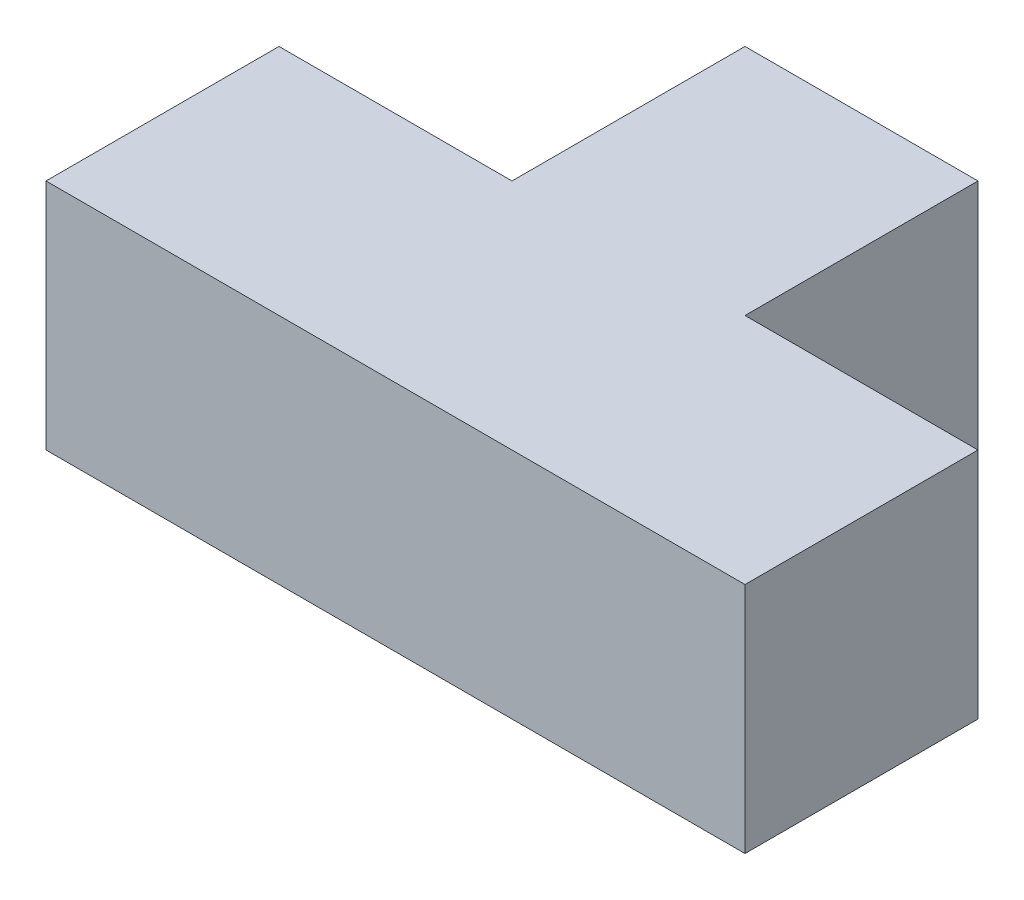
ISO-10303-21;
HEADER;
FILE_DESCRIPTION(('STEP AP214'),'2;1');
FILE_NAME('part.step','',(''),(''),'','','');
FILE_SCHEMA(('AUTOMOTIVE_DESIGN { 1 0 10303 214 1 1 1 1 }'));
ENDSEC;
DATA;
#1=APPLICATION_CONTEXT('core data for automotive mechanical design processes');
#2=APPLICATION_PROTOCOL_DEFINITION('international standard','automotive_design',2000,#1);
#3=PRODUCT_CONTEXT('',#1,'mechanical');
#4=PRODUCT('Part','Part','',(#3));
#5=PRODUCT_RELATED_PRODUCT_CATEGORY('part','',(#4));
#6=PRODUCT_DEFINITION_FORMATION('','',#4);
#7=PRODUCT_DEFINITION_CONTEXT('part definition',#1,'design');
#8=PRODUCT_DEFINITION('design','',#6,#7);
#9=PRODUCT_DEFINITION_SHAPE('','',#8);
#10=(LENGTH_UNIT() NAMED_UNIT(*) SI_UNIT(.MILLI.,.METRE.));
#11=(NAMED_UNIT(*) PLANE_ANGLE_UNIT() SI_UNIT($,.RADIAN.));
#12=(NAMED_UNIT(*) SI_UNIT($,.STERADIAN.) SOLID_ANGLE_UNIT());
#13=UNCERTAINTY_MEASURE_WITH_UNIT(LENGTH_MEASURE(1.E-05),#10,'distance_accuracy_value','');
#14=(GEOMETRIC_REPRESENTATION_CONTEXT(3) GLOBAL_UNCERTAINTY_ASSIGNED_CONTEXT((#13)) GLOBAL_UNIT_ASSIGNED_CONTEXT((#10,
#11,#12)) REPRESENTATION_CONTEXT('',''));
#15=CARTESIAN_POINT('',(0.,0.,0.));
#16=DIRECTION('',(0.,0.,1.));
#17=DIRECTION('',(1.,0.,0.));
#18=AXIS2_PLACEMENT_3D('',#15,#16,#17);
#19=CARTESIAN_POINT('',(0.,30.,0.));
#20=DIRECTION('',(0.,0.,-1.));
#21=DIRECTION('',(-1.,0.,0.));
#22=AXIS2_PLACEMENT_3D('',#19,#20,#21);
#23=PLANE('',#22);
#24=DIRECTION('',(1.,0.,0.));
#25=VECTOR('',#24,1.);
#26=CARTESIAN_POINT('',(0.,0.,0.));
#27=LINE('',#26,#25);
#28=CARTESIAN_POINT('',(-30.,0.,0.));
#29=VERTEX_POINT('',#28);
#30=CARTESIAN_POINT('',(60.,0.,0.));
#31=VERTEX_POINT('',#30);
#32=EDGE_CURVE('E129',#29,#31,#27,.T.);
#33=ORIENTED_EDGE('',*,*,#32,.T.);
#34=DIRECTION('',(0.,-1.,0.));
#35=VECTOR('',#34,1.);
#36=CARTESIAN_POINT('',(60.,30.,0.));
#37=LINE('',#36,#35);
#38=CARTESIAN_POINT('',(60.,30.,0.));
#39=VERTEX_POINT('',#38);
#40=EDGE_CURVE('E11',#39,#31,#37,.T.);
#41=ORIENTED_EDGE('',*,*,#40,.F.);
#42=DIRECTION('',(1.,0.,0.));
#43=VECTOR('',#42,1.);
#44=CARTESIAN_POINT('',(0.,30.,0.));
#45=LINE('',#44,#43);
#46=CARTESIAN_POINT('',(-30.,30.,0.));
#47=VERTEX_POINT('',#46);
#48=EDGE_CURVE('E122',#47,#39,#45,.T.);
#49=ORIENTED_EDGE('',*,*,#48,.F.);
#50=DIRECTION('',(0.,1.,0.));
#51=VECTOR('',#50,1.);
#52=CARTESIAN_POINT('',(-30.,0.,0.));
#53=LINE('',#52,#51);
#54=EDGE_CURVE('E172',#29,#47,#53,.T.);
#55=ORIENTED_EDGE('',*,*,#54,.F.);
#56=EDGE_LOOP('',(#33,#41,#49,#55));
#57=FACE_BOUND('',#56,.T.);
#58=ADVANCED_FACE('F39',(#57),#23,.F.);
#59=CARTESIAN_POINT('',(60.,30.,0.));
#60=DIRECTION('',(-1.,0.,0.));
#61=DIRECTION('',(0.,0.,1.));
#62=AXIS2_PLACEMENT_3D('',#59,#60,#61);
#63=PLANE('',#62);
#64=DIRECTION('',(0.,0.,-1.));
#65=VECTOR('',#64,1.);
#66=CARTESIAN_POINT('',(60.,0.,0.));
#67=LINE('',#66,#65);
#68=CARTESIAN_POINT('',(60.,0.,-30.));
#69=VERTEX_POINT('',#68);
#70=EDGE_CURVE('E132',#31,#69,#67,.T.);
#71=ORIENTED_EDGE('',*,*,#70,.T.);
#72=DIRECTION('',(0.,-1.,0.));
#73=VECTOR('',#72,1.);
#74=CARTESIAN_POINT('',(60.,30.,-30.));
#75=LINE('',#74,#73);
#76=CARTESIAN_POINT('',(60.,30.,-30.));
#77=VERTEX_POINT('',#76);
#78=EDGE_CURVE('E46',#77,#69,#75,.T.);
#79=ORIENTED_EDGE('',*,*,#78,.F.);
#80=DIRECTION('',(0.,0.,-1.));
#81=VECTOR('',#80,1.);
#82=CARTESIAN_POINT('',(60.,30.,0.));
#83=LINE('',#82,#81);
#84=EDGE_CURVE('E90',#39,#77,#83,.T.);
#85=ORIENTED_EDGE('',*,*,#84,.F.);
#86=ORIENTED_EDGE('',*,*,#40,.T.);
#87=EDGE_LOOP('',(#71,#79,#85,#86));
#88=FACE_BOUND('',#87,.T.);
#89=ADVANCED_FACE('F143',(#88),#63,.F.);
#90=CARTESIAN_POINT('',(0.,30.,-30.));
#91=DIRECTION('',(0.,0.,-1.));
#92=DIRECTION('',(-1.,0.,0.));
#93=AXIS2_PLACEMENT_3D('',#90,#91,#92);
#94=PLANE('',#93);
#95=DIRECTION('',(1.,0.,0.));
#96=VECTOR('',#95,1.);
#97=CARTESIAN_POINT('',(0.,0.,-30.));
#98=LINE('',#97,#96);
#99=CARTESIAN_POINT('',(30.,0.,-30.));
#100=VERTEX_POINT('',#99);
#101=EDGE_CURVE('E106',#100,#69,#98,.T.);
#102=ORIENTED_EDGE('',*,*,#101,.F.);
#103=DIRECTION('',(0.,-1.,0.));
#104=VECTOR('',#103,1.);
#105=CARTESIAN_POINT('',(30.,30.,-30.));
#106=LINE('',#105,#104);
#107=CARTESIAN_POINT('',(30.,30.,-30.));
#108=VERTEX_POINT('',#107);
#109=EDGE_CURVE('E100',#108,#100,#106,.T.);
#110=ORIENTED_EDGE('',*,*,#109,.F.);
#111=DIRECTION('',(1.,0.,0.));
#112=VECTOR('',#111,1.);
#113=CARTESIAN_POINT('',(0.,30.,-30.));
#114=LINE('',#113,#112);
#115=EDGE_CURVE('E104',#108,#77,#114,.T.);
#116=ORIENTED_EDGE('',*,*,#115,.T.);
#117=ORIENTED_EDGE('',*,*,#78,.T.);
#118=EDGE_LOOP('',(#102,#110,#116,#117));
#119=FACE_BOUND('',#118,.T.);
#120=ADVANCED_FACE('F102',(#119),#94,.T.);
#121=CARTESIAN_POINT('',(30.,30.,0.));
#122=DIRECTION('',(-1.,0.,0.));
#123=DIRECTION('',(0.,0.,1.));
#124=AXIS2_PLACEMENT_3D('',#121,#122,#123);
#125=PLANE('',#124);
#126=DIRECTION('',(0.,0.,-1.));
#127=VECTOR('',#126,1.);
#128=CARTESIAN_POINT('',(30.,0.,0.));
#129=LINE('',#128,#127);
#130=CARTESIAN_POINT('',(30.,0.,-60.));
#131=VERTEX_POINT('',#130);
#132=EDGE_CURVE('E137',#100,#131,#129,.T.);
#133=ORIENTED_EDGE('',*,*,#132,.T.);
#134=DIRECTION('',(0.,-1.,0.));
#135=VECTOR('',#134,1.);
#136=CARTESIAN_POINT('',(30.,30.,-60.));
#137=LINE('',#136,#135);
#138=CARTESIAN_POINT('',(30.,30.,-60.));
#139=VERTEX_POINT('',#138);
#140=EDGE_CURVE('E110',#139,#131,#137,.T.);
#141=ORIENTED_EDGE('',*,*,#140,.F.);
#142=DIRECTION('',(0.,0.,-1.));
#143=VECTOR('',#142,1.);
#144=CARTESIAN_POINT('',(30.,30.,0.));
#145=LINE('',#144,#143);
#146=EDGE_CURVE('E113',#108,#139,#145,.T.);
#147=ORIENTED_EDGE('',*,*,#146,.F.);
#148=ORIENTED_EDGE('',*,*,#109,.T.);
#149=EDGE_LOOP('',(#133,#141,#147,#148));
#150=FACE_BOUND('',#149,.T.);
#151=ADVANCED_FACE('F114',(#150),#125,.F.);
#152=CARTESIAN_POINT('',(0.,30.,-60.));
#153=DIRECTION('',(0.,0.,-1.));
#154=DIRECTION('',(-1.,0.,0.));
#155=AXIS2_PLACEMENT_3D('',#152,#153,#154);
#156=PLANE('',#155);
#157=DIRECTION('',(1.,0.,0.));
#158=VECTOR('',#157,1.);
#159=CARTESIAN_POINT('',(0.,0.,-60.));
#160=LINE('',#159,#158);
#161=CARTESIAN_POINT('',(0.,0.,-60.));
#162=VERTEX_POINT('',#161);
#163=EDGE_CURVE('E139',#162,#131,#160,.T.);
#164=ORIENTED_EDGE('',*,*,#163,.F.);
#165=DIRECTION('',(0.,-1.,0.));
#166=VECTOR('',#165,1.);
#167=CARTESIAN_POINT('',(0.,30.,-60.));
#168=LINE('',#167,#166);
#169=CARTESIAN_POINT('',(0.,30.,-60.));
#170=VERTEX_POINT('',#169);
#171=EDGE_CURVE('E128',#170,#162,#168,.T.);
#172=ORIENTED_EDGE('',*,*,#171,.F.);
#173=DIRECTION('',(1.,0.,0.));
#174=VECTOR('',#173,1.);
#175=CARTESIAN_POINT('',(0.,30.,-60.));
#176=LINE('',#175,#174);
#177=EDGE_CURVE('E118',#170,#139,#176,.T.);
#178=ORIENTED_EDGE('',*,*,#177,.T.);
#179=ORIENTED_EDGE('',*,*,#140,.T.);
#180=EDGE_LOOP('',(#164,#172,#178,#179));
#181=FACE_BOUND('',#180,.T.);
#182=ADVANCED_FACE('F149',(#181),#156,.T.);
#183=CARTESIAN_POINT('',(0.,30.,0.));
#184=DIRECTION('',(-1.,0.,0.));
#185=DIRECTION('',(0.,0.,1.));
#186=AXIS2_PLACEMENT_3D('',#183,#184,#185);
#187=PLANE('',#186);
#188=DIRECTION('',(0.,-1.,0.));
#189=VECTOR('',#188,1.);
#190=CARTESIAN_POINT('',(0.,30.,-30.));
#191=LINE('',#190,#189);
#192=CARTESIAN_POINT('',(0.,30.,-30.));
#193=VERTEX_POINT('',#192);
#194=CARTESIAN_POINT('',(0.,0.,-30.));
#195=VERTEX_POINT('',#194);
#196=EDGE_CURVE('E53',#193,#195,#191,.T.);
#197=ORIENTED_EDGE('',*,*,#196,.F.);
#198=DIRECTION('',(0.,0.,-1.));
#199=VECTOR('',#198,1.);
#200=CARTESIAN_POINT('',(0.,30.,0.));
#201=LINE('',#200,#199);
#202=EDGE_CURVE('E58',#193,#170,#201,.T.);
#203=ORIENTED_EDGE('',*,*,#202,.T.);
#204=ORIENTED_EDGE('',*,*,#171,.T.);
#205=DIRECTION('',(0.,0.,-1.));
#206=VECTOR('',#205,1.);
#207=CARTESIAN_POINT('',(0.,0.,0.));
#208=LINE('',#207,#206);
#209=EDGE_CURVE('E83',#195,#162,#208,.T.);
#210=ORIENTED_EDGE('',*,*,#209,.F.);
#211=EDGE_LOOP('',(#197,#203,#204,#210));
#212=FACE_BOUND('',#211,.T.);
#213=ADVANCED_FACE('F185',(#212),#187,.T.);
#214=CARTESIAN_POINT('',(0.,30.,0.));
#215=DIRECTION('',(0.,1.,0.));
#216=DIRECTION('',(0.,0.,1.));
#217=AXIS2_PLACEMENT_3D('',#214,#215,#216);
#218=PLANE('',#217);
#219=ORIENTED_EDGE('',*,*,#48,.T.);
#220=ORIENTED_EDGE('',*,*,#84,.T.);
#221=ORIENTED_EDGE('',*,*,#115,.F.);
#222=ORIENTED_EDGE('',*,*,#146,.T.);
#223=ORIENTED_EDGE('',*,*,#177,.F.);
#224=ORIENTED_EDGE('',*,*,#202,.F.);
#225=DIRECTION('',(1.,0.,0.));
#226=VECTOR('',#225,1.);
#227=CARTESIAN_POINT('',(-30.,30.,-30.));
#228=LINE('',#227,#226);
#229=CARTESIAN_POINT('',(-30.,30.,-30.));
#230=VERTEX_POINT('',#229);
#231=EDGE_CURVE('E133',#230,#193,#228,.T.);
#232=ORIENTED_EDGE('',*,*,#231,.F.);
#233=DIRECTION('',(0.,0.,-1.));
#234=VECTOR('',#233,1.);
#235=CARTESIAN_POINT('',(-30.,30.,0.));
#236=LINE('',#235,#234);
#237=EDGE_CURVE('E168',#47,#230,#236,.T.);
#238=ORIENTED_EDGE('',*,*,#237,.F.);
#239=EDGE_LOOP('',(#219,#220,#221,#222,#223,#224,#232,#238));
#240=FACE_BOUND('',#239,.T.);
#241=ADVANCED_FACE('F120',(#240),#218,.T.);
#242=CARTESIAN_POINT('',(0.,0.,0.));
#243=DIRECTION('',(0.,1.,0.));
#244=DIRECTION('',(0.,0.,1.));
#245=AXIS2_PLACEMENT_3D('',#242,#243,#244);
#246=PLANE('',#245);
#247=ORIENTED_EDGE('',*,*,#32,.F.);
#248=DIRECTION('',(0.,0.,1.));
#249=VECTOR('',#248,1.);
#250=CARTESIAN_POINT('',(-30.,0.,-30.));
#251=LINE('',#250,#249);
#252=CARTESIAN_POINT('',(-30.,0.,-30.));
#253=VERTEX_POINT('',#252);
#254=EDGE_CURVE('E162',#253,#29,#251,.T.);
#255=ORIENTED_EDGE('',*,*,#254,.F.);
#256=DIRECTION('',(1.,0.,0.));
#257=VECTOR('',#256,1.);
#258=CARTESIAN_POINT('',(-30.,0.,-30.));
#259=LINE('',#258,#257);
#260=EDGE_CURVE('E160',#253,#195,#259,.T.);
#261=ORIENTED_EDGE('',*,*,#260,.T.);
#262=ORIENTED_EDGE('',*,*,#209,.T.);
#263=ORIENTED_EDGE('',*,*,#163,.T.);
#264=ORIENTED_EDGE('',*,*,#132,.F.);
#265=ORIENTED_EDGE('',*,*,#101,.T.);
#266=ORIENTED_EDGE('',*,*,#70,.F.);
#267=EDGE_LOOP('',(#247,#255,#261,#262,#263,#264,#265,#266));
#268=FACE_BOUND('',#267,.T.);
#269=ADVANCED_FACE('F146',(#268),#246,.F.);
#270=CARTESIAN_POINT('',(-30.,30.,-30.));
#271=DIRECTION('',(0.,0.,1.));
#272=DIRECTION('',(1.,0.,0.));
#273=AXIS2_PLACEMENT_3D('',#270,#271,#272);
#274=PLANE('',#273);
#275=ORIENTED_EDGE('',*,*,#196,.T.);
#276=ORIENTED_EDGE('',*,*,#260,.F.);
#277=DIRECTION('',(0.,-1.,0.));
#278=VECTOR('',#277,1.);
#279=CARTESIAN_POINT('',(-30.,30.,-30.));
#280=LINE('',#279,#278);
#281=EDGE_CURVE('E159',#230,#253,#280,.T.);
#282=ORIENTED_EDGE('',*,*,#281,.F.);
#283=ORIENTED_EDGE('',*,*,#231,.T.);
#284=EDGE_LOOP('',(#275,#276,#282,#283));
#285=FACE_BOUND('',#284,.T.);
#286=ADVANCED_FACE('F156',(#285),#274,.F.);
#287=CARTESIAN_POINT('',(-30.,0.,0.));
#288=DIRECTION('',(-1.,0.,0.));
#289=DIRECTION('',(0.,0.,1.));
#290=AXIS2_PLACEMENT_3D('',#287,#288,#289);
#291=PLANE('',#290);
#292=ORIENTED_EDGE('',*,*,#54,.T.);
#293=ORIENTED_EDGE('',*,*,#237,.T.);
#294=ORIENTED_EDGE('',*,*,#281,.T.);
#295=ORIENTED_EDGE('',*,*,#254,.T.);
#296=EDGE_LOOP('',(#292,#293,#294,#295));
#297=FACE_BOUND('',#296,.T.);
#298=ADVANCED_FACE('F177',(#297),#291,.T.);
#299=CLOSED_SHELL('',(#58,#89,#120,#151,#182,#213,#241,#269,#286,#298));
#300=MANIFOLD_SOLID_BREP('B2',#299);
#301=ADVANCED_BREP_SHAPE_REPRESENTATION('',(#18,#300),#14);
#302=SHAPE_DEFINITION_REPRESENTATION(#9,#301);
ENDSEC;
END-ISO-10303-21;
